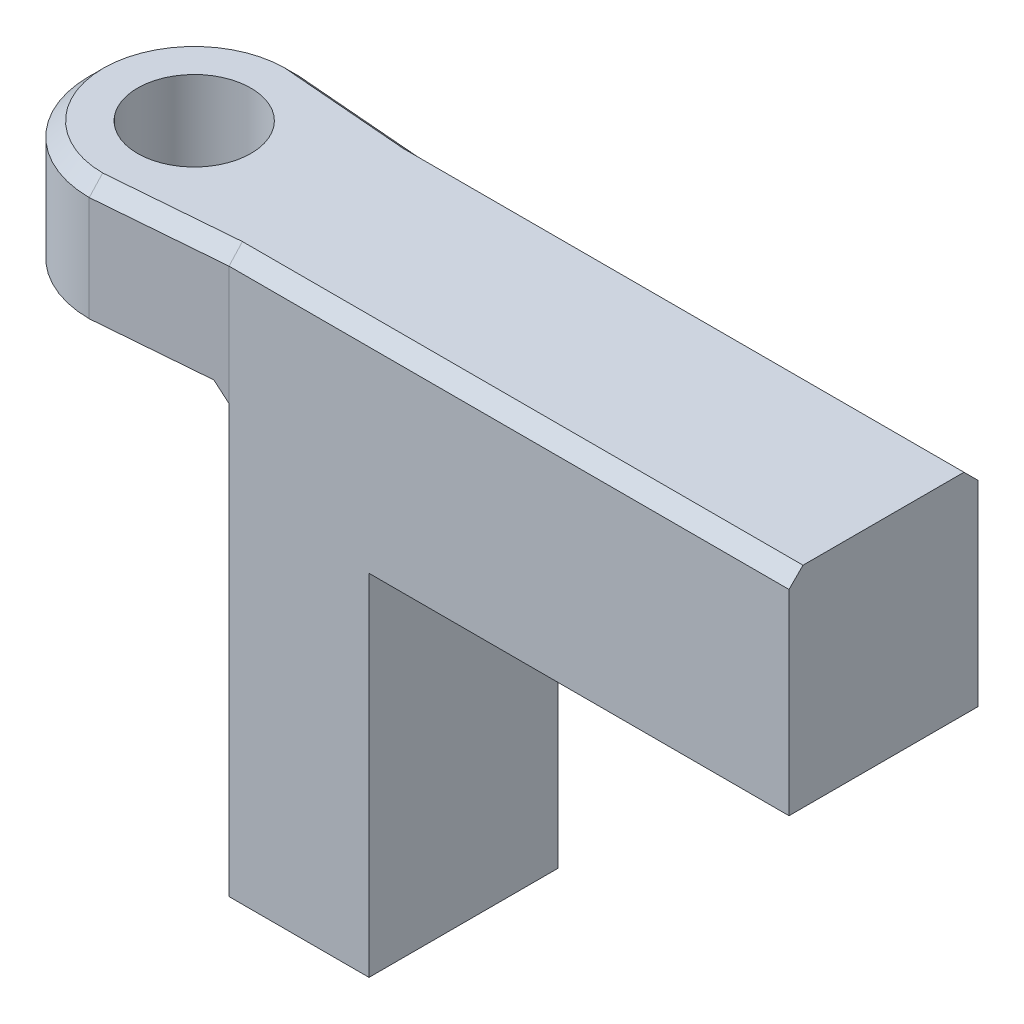
ISO-10303-21;
HEADER;
FILE_DESCRIPTION(('STEP AP214'),'2;1');
FILE_NAME('part.step','',(''),(''),'','','');
FILE_SCHEMA(('AUTOMOTIVE_DESIGN { 1 0 10303 214 1 1 1 1 }'));
ENDSEC;
DATA;
#1=APPLICATION_CONTEXT('core data for automotive mechanical design processes');
#2=APPLICATION_PROTOCOL_DEFINITION('international standard','automotive_design',2000,#1);
#3=PRODUCT_CONTEXT('',#1,'mechanical');
#4=PRODUCT('Part','Part','',(#3));
#5=PRODUCT_RELATED_PRODUCT_CATEGORY('part','',(#4));
#6=PRODUCT_DEFINITION_FORMATION('','',#4);
#7=PRODUCT_DEFINITION_CONTEXT('part definition',#1,'design');
#8=PRODUCT_DEFINITION('design','',#6,#7);
#9=PRODUCT_DEFINITION_SHAPE('','',#8);
#10=(LENGTH_UNIT() NAMED_UNIT(*) SI_UNIT(.MILLI.,.METRE.));
#11=(NAMED_UNIT(*) PLANE_ANGLE_UNIT() SI_UNIT($,.RADIAN.));
#12=(NAMED_UNIT(*) SI_UNIT($,.STERADIAN.) SOLID_ANGLE_UNIT());
#13=UNCERTAINTY_MEASURE_WITH_UNIT(LENGTH_MEASURE(1.E-05),#10,'distance_accuracy_value','');
#14=(GEOMETRIC_REPRESENTATION_CONTEXT(3) GLOBAL_UNCERTAINTY_ASSIGNED_CONTEXT((#13)) GLOBAL_UNIT_ASSIGNED_CONTEXT((#10,
#11,#12)) REPRESENTATION_CONTEXT('',''));
#15=CARTESIAN_POINT('',(0.,0.,0.));
#16=DIRECTION('',(0.,0.,1.));
#17=DIRECTION('',(1.,0.,0.));
#18=AXIS2_PLACEMENT_3D('',#15,#16,#17);
#19=CARTESIAN_POINT('',(38.4710133724813,-65.,0.));
#20=DIRECTION('',(-1.,0.,0.));
#21=DIRECTION('',(0.,0.,1.));
#22=AXIS2_PLACEMENT_3D('',#19,#20,#21);
#23=PLANE('',#22);
#24=DIRECTION('',(0.,0.,-1.));
#25=VECTOR('',#24,1.);
#26=CARTESIAN_POINT('',(38.4710133724813,-15.,13.5));
#27=LINE('',#26,#25);
#28=CARTESIAN_POINT('',(38.4710133724813,-15.,13.5));
#29=VERTEX_POINT('',#28);
#30=CARTESIAN_POINT('',(38.4710133724813,-15.,-13.5));
#31=VERTEX_POINT('',#30);
#32=EDGE_CURVE('E173',#29,#31,#27,.T.);
#33=ORIENTED_EDGE('',*,*,#32,.F.);
#34=DIRECTION('',(0.,1.,0.));
#35=VECTOR('',#34,1.);
#36=CARTESIAN_POINT('',(38.4710133724813,-65.,13.5));
#37=LINE('',#36,#35);
#38=CARTESIAN_POINT('',(38.4710133724813,-65.,13.5));
#39=VERTEX_POINT('',#38);
#40=EDGE_CURVE('E160',#39,#29,#37,.T.);
#41=ORIENTED_EDGE('',*,*,#40,.F.);
#42=DIRECTION('',(0.,0.,1.));
#43=VECTOR('',#42,1.);
#44=CARTESIAN_POINT('',(38.4710133724813,-65.,0.));
#45=LINE('',#44,#43);
#46=CARTESIAN_POINT('',(38.4710133724813,-65.,-13.5));
#47=VERTEX_POINT('',#46);
#48=EDGE_CURVE('E183',#47,#39,#45,.T.);
#49=ORIENTED_EDGE('',*,*,#48,.F.);
#50=DIRECTION('',(0.,1.,0.));
#51=VECTOR('',#50,1.);
#52=CARTESIAN_POINT('',(38.4710133724813,-65.,-13.5));
#53=LINE('',#52,#51);
#54=EDGE_CURVE('E186',#47,#31,#53,.T.);
#55=ORIENTED_EDGE('',*,*,#54,.T.);
#56=EDGE_LOOP('',(#33,#41,#49,#55));
#57=FACE_BOUND('',#56,.T.);
#58=ADVANCED_FACE('F45',(#57),#23,.F.);
#59=CARTESIAN_POINT('',(1.21014418007502,15.,14.9017262218641));
#60=DIRECTION('',(0.0809418631430002,0.,0.996718824338609));
#61=DIRECTION('',(0.99671882433861,0.,-0.0809418631430002));
#62=AXIS2_PLACEMENT_3D('',#59,#60,#61);
#63=PLANE('',#62);
#64=DIRECTION('',(0.,-1.,0.));
#65=VECTOR('',#64,1.);
#66=CARTESIAN_POINT('',(18.4710133724813,15.,13.5));
#67=LINE('',#66,#65);
#68=CARTESIAN_POINT('',(18.4710133724813,13.,13.5));
#69=VERTEX_POINT('',#68);
#70=CARTESIAN_POINT('',(18.4710133724813,-4.,13.5));
#71=VERTEX_POINT('',#70);
#72=EDGE_CURVE('E233',#69,#71,#67,.T.);
#73=ORIENTED_EDGE('',*,*,#72,.F.);
#74=DIRECTION('',(-0.99671882433861,0.,0.0809418631430002));
#75=VECTOR('',#74,1.);
#76=CARTESIAN_POINT('',(1.21014418007502,13.,14.9017262218641));
#77=LINE('',#76,#75);
#78=CARTESIAN_POINT('',(0.,13.,15.));
#79=VERTEX_POINT('',#78);
#80=EDGE_CURVE('E54',#69,#79,#77,.T.);
#81=ORIENTED_EDGE('',*,*,#80,.T.);
#82=DIRECTION('',(0.,-1.,0.));
#83=VECTOR('',#82,1.);
#84=CARTESIAN_POINT('',(0.,15.,15.));
#85=LINE('',#84,#83);
#86=CARTESIAN_POINT('',(0.,-2.,15.));
#87=VERTEX_POINT('',#86);
#88=EDGE_CURVE('E225',#79,#87,#85,.T.);
#89=ORIENTED_EDGE('',*,*,#88,.T.);
#90=DIRECTION('',(-0.99671882433861,0.,0.0809418631430002));
#91=VECTOR('',#90,1.);
#92=CARTESIAN_POINT('',(1.21014418007502,-2.,14.9017262218641));
#93=LINE('',#92,#91);
#94=CARTESIAN_POINT('',(16.4710133724813,-2.,13.6624166438247));
#95=VERTEX_POINT('',#94);
#96=EDGE_CURVE('E210',#95,#87,#93,.T.);
#97=ORIENTED_EDGE('',*,*,#96,.F.);
#98=DIRECTION('',(0.705943850922591,-0.705943850922582,-0.0573285154977738));
#99=VECTOR('',#98,1.);
#100=CARTESIAN_POINT('',(17.023941115335,-2.5529277428537,13.6175143096888));
#101=LINE('',#100,#99);
#102=EDGE_CURVE('E241',#95,#71,#101,.T.);
#103=ORIENTED_EDGE('',*,*,#102,.T.);
#104=EDGE_LOOP('',(#73,#81,#89,#97,#103));
#105=FACE_BOUND('',#104,.T.);
#106=ADVANCED_FACE('F301',(#105),#63,.T.);
#107=CARTESIAN_POINT('',(1.21014418007503,15.,-14.9017262218641));
#108=DIRECTION('',(0.0809418631430008,0.,-0.996718824338609));
#109=DIRECTION('',(-0.99671882433861,0.,-0.0809418631430008));
#110=AXIS2_PLACEMENT_3D('',#107,#108,#109);
#111=PLANE('',#110);
#112=DIRECTION('',(0.,-1.,0.));
#113=VECTOR('',#112,1.);
#114=CARTESIAN_POINT('',(0.,15.,-15.));
#115=LINE('',#114,#113);
#116=CARTESIAN_POINT('',(0.,13.,-15.));
#117=VERTEX_POINT('',#116);
#118=CARTESIAN_POINT('',(0.,-2.,-15.));
#119=VERTEX_POINT('',#118);
#120=EDGE_CURVE('E229',#117,#119,#115,.T.);
#121=ORIENTED_EDGE('',*,*,#120,.F.);
#122=DIRECTION('',(0.99671882433861,0.,0.0809418631430008));
#123=VECTOR('',#122,1.);
#124=CARTESIAN_POINT('',(1.21014418007503,13.,-14.9017262218641));
#125=LINE('',#124,#123);
#126=CARTESIAN_POINT('',(18.4710133724813,13.,-13.5));
#127=VERTEX_POINT('',#126);
#128=EDGE_CURVE('E263',#117,#127,#125,.T.);
#129=ORIENTED_EDGE('',*,*,#128,.T.);
#130=DIRECTION('',(0.,-1.,0.));
#131=VECTOR('',#130,1.);
#132=CARTESIAN_POINT('',(18.4710133724813,15.,-13.5));
#133=LINE('',#132,#131);
#134=CARTESIAN_POINT('',(18.4710133724813,-4.,-13.5));
#135=VERTEX_POINT('',#134);
#136=EDGE_CURVE('E231',#127,#135,#133,.T.);
#137=ORIENTED_EDGE('',*,*,#136,.T.);
#138=DIRECTION('',(-0.705943850922591,0.705943850922582,-0.0573285154977743));
#139=VECTOR('',#138,1.);
#140=CARTESIAN_POINT('',(17.023941115335,-2.5529277428537,-13.6175143096888));
#141=LINE('',#140,#139);
#142=CARTESIAN_POINT('',(16.4710133724813,-2.,-13.6624166438247));
#143=VERTEX_POINT('',#142);
#144=EDGE_CURVE('E244',#135,#143,#141,.T.);
#145=ORIENTED_EDGE('',*,*,#144,.T.);
#146=DIRECTION('',(0.99671882433861,0.,0.0809418631430008));
#147=VECTOR('',#146,1.);
#148=CARTESIAN_POINT('',(1.21014418007503,-2.,-14.9017262218641));
#149=LINE('',#148,#147);
#150=EDGE_CURVE('E213',#119,#143,#149,.T.);
#151=ORIENTED_EDGE('',*,*,#150,.F.);
#152=EDGE_LOOP('',(#121,#129,#137,#145,#151));
#153=FACE_BOUND('',#152,.T.);
#154=ADVANCED_FACE('F307',(#153),#111,.T.);
#155=CARTESIAN_POINT('',(0.,15.,0.));
#156=DIRECTION('',(0.,-1.,0.));
#157=DIRECTION('',(0.,0.,-1.));
#158=AXIS2_PLACEMENT_3D('',#155,#156,#157);
#159=CYLINDRICAL_SURFACE('',#158,8.1);
#160=CARTESIAN_POINT('',(0.,15.,0.));
#161=DIRECTION('',(0.,1.,0.));
#162=DIRECTION('',(0.,0.,1.));
#163=AXIS2_PLACEMENT_3D('',#160,#161,#162);
#164=CIRCLE('',#163,8.1);
#165=CARTESIAN_POINT('',(0.,15.,8.1));
#166=VERTEX_POINT('',#165);
#167=EDGE_CURVE('E222',#166,#166,#164,.T.);
#168=ORIENTED_EDGE('',*,*,#167,.T.);
#169=EDGE_LOOP('',(#168));
#170=FACE_BOUND('',#169,.T.);
#171=CARTESIAN_POINT('',(0.,0.,0.));
#172=DIRECTION('',(0.,1.,0.));
#173=DIRECTION('',(0.,0.,1.));
#174=AXIS2_PLACEMENT_3D('',#171,#172,#173);
#175=CIRCLE('',#174,8.1);
#176=CARTESIAN_POINT('',(0.,0.,8.1));
#177=VERTEX_POINT('',#176);
#178=EDGE_CURVE('E219',#177,#177,#175,.T.);
#179=ORIENTED_EDGE('',*,*,#178,.F.);
#180=EDGE_LOOP('',(#179));
#181=FACE_BOUND('',#180,.T.);
#182=ADVANCED_FACE('F358',(#170,#181),#159,.F.);
#183=CARTESIAN_POINT('',(0.,15.,0.));
#184=DIRECTION('',(0.,-1.,0.));
#185=DIRECTION('',(0.,0.,-1.));
#186=AXIS2_PLACEMENT_3D('',#183,#184,#185);
#187=CYLINDRICAL_SURFACE('',#186,15.);
#188=ORIENTED_EDGE('',*,*,#88,.F.);
#189=CARTESIAN_POINT('',(0.,13.,0.));
#190=DIRECTION('',(0.,1.,0.));
#191=DIRECTION('',(0.,0.,1.));
#192=AXIS2_PLACEMENT_3D('',#189,#190,#191);
#193=CIRCLE('',#192,15.);
#194=EDGE_CURVE('E11',#79,#117,#193,.F.);
#195=ORIENTED_EDGE('',*,*,#194,.T.);
#196=ORIENTED_EDGE('',*,*,#120,.T.);
#197=CARTESIAN_POINT('',(0.,-2.,0.));
#198=DIRECTION('',(0.,1.,0.));
#199=DIRECTION('',(0.,0.,1.));
#200=AXIS2_PLACEMENT_3D('',#197,#198,#199);
#201=CIRCLE('',#200,15.);
#202=EDGE_CURVE('E216',#119,#87,#201,.T.);
#203=ORIENTED_EDGE('',*,*,#202,.T.);
#204=EDGE_LOOP('',(#188,#195,#196,#203));
#205=FACE_BOUND('',#204,.T.);
#206=ADVANCED_FACE('F354',(#205),#187,.T.);
#207=CARTESIAN_POINT('',(0.,15.,0.));
#208=DIRECTION('',(0.,1.,0.));
#209=DIRECTION('',(0.,0.,1.));
#210=AXIS2_PLACEMENT_3D('',#207,#208,#209);
#211=PLANE('',#210);
#212=ORIENTED_EDGE('',*,*,#167,.F.);
#213=EDGE_LOOP('',(#212));
#214=FACE_BOUND('',#213,.T.);
#215=DIRECTION('',(0.99671882433861,0.,-0.0809418631430002));
#216=VECTOR('',#215,1.);
#217=CARTESIAN_POINT('',(1.04826045378902,15.,12.9082885731869));
#218=LINE('',#217,#216);
#219=CARTESIAN_POINT('',(-0.0781800510825452,15.,12.9997649163211));
#220=VERTEX_POINT('',#219);
#221=CARTESIAN_POINT('',(18.3899384988876,15.,11.5));
#222=VERTEX_POINT('',#221);
#223=EDGE_CURVE('E250',#220,#222,#218,.T.);
#224=ORIENTED_EDGE('',*,*,#223,.T.);
#225=DIRECTION('',(1.,0.,0.));
#226=VECTOR('',#225,1.);
#227=CARTESIAN_POINT('',(98.4710133724813,15.,11.5));
#228=LINE('',#227,#226);
#229=CARTESIAN_POINT('',(98.4710133724813,15.,11.5));
#230=VERTEX_POINT('',#229);
#231=EDGE_CURVE('E256',#222,#230,#228,.T.);
#232=ORIENTED_EDGE('',*,*,#231,.T.);
#233=DIRECTION('',(0.,0.,1.));
#234=VECTOR('',#233,1.);
#235=CARTESIAN_POINT('',(98.4710133724813,15.,13.5));
#236=LINE('',#235,#234);
#237=CARTESIAN_POINT('',(98.4710133724813,15.,-11.5));
#238=VERTEX_POINT('',#237);
#239=EDGE_CURVE('E152',#238,#230,#236,.T.);
#240=ORIENTED_EDGE('',*,*,#239,.F.);
#241=DIRECTION('',(-1.,0.,0.));
#242=VECTOR('',#241,1.);
#243=CARTESIAN_POINT('',(18.4710133724813,15.,-11.5));
#244=LINE('',#243,#242);
#245=CARTESIAN_POINT('',(18.3899384988873,15.,-11.5));
#246=VERTEX_POINT('',#245);
#247=EDGE_CURVE('E254',#238,#246,#244,.T.);
#248=ORIENTED_EDGE('',*,*,#247,.T.);
#249=DIRECTION('',(-0.99671882433861,0.,-0.0809418631430009));
#250=VECTOR('',#249,1.);
#251=CARTESIAN_POINT('',(1.04826045378902,15.,-12.9082885731869));
#252=LINE('',#251,#250);
#253=CARTESIAN_POINT('',(-0.0781800510825289,15.,-12.9997649163211));
#254=VERTEX_POINT('',#253);
#255=EDGE_CURVE('E252',#246,#254,#252,.T.);
#256=ORIENTED_EDGE('',*,*,#255,.T.);
#257=CARTESIAN_POINT('',(0.,15.,0.));
#258=DIRECTION('',(0.,1.,0.));
#259=DIRECTION('',(0.,0.,1.));
#260=AXIS2_PLACEMENT_3D('',#257,#258,#259);
#261=CIRCLE('',#260,13.);
#262=EDGE_CURVE('E248',#254,#220,#261,.T.);
#263=ORIENTED_EDGE('',*,*,#262,.T.);
#264=EDGE_LOOP('',(#224,#232,#240,#248,#256,#263));
#265=FACE_BOUND('',#264,.T.);
#266=ADVANCED_FACE('F350',(#214,#265),#211,.T.);
#267=CARTESIAN_POINT('',(0.,-2.,0.));
#268=DIRECTION('',(0.,1.,0.));
#269=DIRECTION('',(0.,0.,1.));
#270=AXIS2_PLACEMENT_3D('',#267,#268,#269);
#271=CYLINDRICAL_SURFACE('',#270,5.);
#272=CARTESIAN_POINT('',(0.,-2.,0.));
#273=DIRECTION('',(0.,1.,0.));
#274=DIRECTION('',(0.,0.,1.));
#275=AXIS2_PLACEMENT_3D('',#272,#273,#274);
#276=CIRCLE('',#275,5.);
#277=CARTESIAN_POINT('',(0.,-2.,5.));
#278=VERTEX_POINT('',#277);
#279=EDGE_CURVE('E207',#278,#278,#276,.T.);
#280=ORIENTED_EDGE('',*,*,#279,.F.);
#281=EDGE_LOOP('',(#280));
#282=FACE_BOUND('',#281,.T.);
#283=CARTESIAN_POINT('',(0.,0.,0.));
#284=DIRECTION('',(0.,1.,0.));
#285=DIRECTION('',(0.,0.,1.));
#286=AXIS2_PLACEMENT_3D('',#283,#284,#285);
#287=CIRCLE('',#286,5.);
#288=CARTESIAN_POINT('',(0.,0.,5.));
#289=VERTEX_POINT('',#288);
#290=EDGE_CURVE('E204',#289,#289,#287,.T.);
#291=ORIENTED_EDGE('',*,*,#290,.T.);
#292=EDGE_LOOP('',(#291));
#293=FACE_BOUND('',#292,.T.);
#294=ADVANCED_FACE('F343',(#282,#293),#271,.F.);
#295=CARTESIAN_POINT('',(0.,-2.,0.));
#296=DIRECTION('',(0.,1.,0.));
#297=DIRECTION('',(0.,0.,1.));
#298=AXIS2_PLACEMENT_3D('',#295,#296,#297);
#299=PLANE('',#298);
#300=CARTESIAN_POINT('',(0.,-2.,10.));
#301=DIRECTION('',(0.,-1.,0.));
#302=DIRECTION('',(0.,0.,-1.));
#303=AXIS2_PLACEMENT_3D('',#300,#301,#302);
#304=CIRCLE('',#303,1.5);
#305=CARTESIAN_POINT('',(0.,-2.,8.5));
#306=VERTEX_POINT('',#305);
#307=EDGE_CURVE('E188',#306,#306,#304,.T.);
#308=ORIENTED_EDGE('',*,*,#307,.F.);
#309=EDGE_LOOP('',(#308));
#310=FACE_BOUND('',#309,.T.);
#311=CARTESIAN_POINT('',(0.,-2.,-10.));
#312=DIRECTION('',(0.,-1.,0.));
#313=DIRECTION('',(0.,0.,-1.));
#314=AXIS2_PLACEMENT_3D('',#311,#312,#313);
#315=CIRCLE('',#314,1.5);
#316=CARTESIAN_POINT('',(0.,-2.,-11.5));
#317=VERTEX_POINT('',#316);
#318=EDGE_CURVE('E198',#317,#317,#315,.T.);
#319=ORIENTED_EDGE('',*,*,#318,.F.);
#320=EDGE_LOOP('',(#319));
#321=FACE_BOUND('',#320,.T.);
#322=ORIENTED_EDGE('',*,*,#279,.T.);
#323=EDGE_LOOP('',(#322));
#324=FACE_BOUND('',#323,.T.);
#325=ORIENTED_EDGE('',*,*,#150,.T.);
#326=DIRECTION('',(0.,0.,1.));
#327=VECTOR('',#326,1.);
#328=CARTESIAN_POINT('',(16.4710133724813,-2.,0.));
#329=LINE('',#328,#327);
#330=EDGE_CURVE('E235',#143,#95,#329,.T.);
#331=ORIENTED_EDGE('',*,*,#330,.T.);
#332=ORIENTED_EDGE('',*,*,#96,.T.);
#333=ORIENTED_EDGE('',*,*,#202,.F.);
#334=EDGE_LOOP('',(#325,#331,#332,#333));
#335=FACE_BOUND('',#334,.T.);
#336=ADVANCED_FACE('F340',(#310,#321,#324,#335),#299,.F.);
#337=CARTESIAN_POINT('',(0.,0.,0.));
#338=DIRECTION('',(0.,1.,0.));
#339=DIRECTION('',(0.,0.,1.));
#340=AXIS2_PLACEMENT_3D('',#337,#338,#339);
#341=PLANE('',#340);
#342=ORIENTED_EDGE('',*,*,#178,.T.);
#343=EDGE_LOOP('',(#342));
#344=FACE_BOUND('',#343,.T.);
#345=ORIENTED_EDGE('',*,*,#290,.F.);
#346=EDGE_LOOP('',(#345));
#347=FACE_BOUND('',#346,.T.);
#348=ADVANCED_FACE('F338',(#344,#347),#341,.T.);
#349=CARTESIAN_POINT('',(0.,8.,-10.));
#350=DIRECTION('',(0.,-1.,0.));
#351=DIRECTION('',(0.,0.,-1.));
#352=AXIS2_PLACEMENT_3D('',#349,#350,#351);
#353=CYLINDRICAL_SURFACE('',#352,1.5);
#354=CARTESIAN_POINT('',(0.,8.,-10.));
#355=DIRECTION('',(0.,-1.,0.));
#356=DIRECTION('',(0.,0.,-1.));
#357=AXIS2_PLACEMENT_3D('',#354,#355,#356);
#358=CIRCLE('',#357,1.5);
#359=CARTESIAN_POINT('',(0.,8.,-11.5));
#360=VERTEX_POINT('',#359);
#361=EDGE_CURVE('E201',#360,#360,#358,.T.);
#362=ORIENTED_EDGE('',*,*,#361,.F.);
#363=EDGE_LOOP('',(#362));
#364=FACE_BOUND('',#363,.T.);
#365=ORIENTED_EDGE('',*,*,#318,.T.);
#366=EDGE_LOOP('',(#365));
#367=FACE_BOUND('',#366,.T.);
#368=ADVANCED_FACE('F334',(#364,#367),#353,.F.);
#369=CARTESIAN_POINT('',(0.,8.,-10.));
#370=DIRECTION('',(0.,-1.,0.));
#371=DIRECTION('',(0.,0.,-1.));
#372=AXIS2_PLACEMENT_3D('',#369,#370,#371);
#373=PLANE('',#372);
#374=ORIENTED_EDGE('',*,*,#361,.T.);
#375=EDGE_LOOP('',(#374));
#376=FACE_BOUND('',#375,.T.);
#377=ADVANCED_FACE('F330',(#376),#373,.T.);
#378=CARTESIAN_POINT('',(0.,8.,10.));
#379=DIRECTION('',(0.,-1.,0.));
#380=DIRECTION('',(0.,0.,-1.));
#381=AXIS2_PLACEMENT_3D('',#378,#379,#380);
#382=CYLINDRICAL_SURFACE('',#381,1.5);
#383=CARTESIAN_POINT('',(0.,8.,10.));
#384=DIRECTION('',(0.,-1.,0.));
#385=DIRECTION('',(0.,0.,-1.));
#386=AXIS2_PLACEMENT_3D('',#383,#384,#385);
#387=CIRCLE('',#386,1.5);
#388=CARTESIAN_POINT('',(0.,8.,8.5));
#389=VERTEX_POINT('',#388);
#390=EDGE_CURVE('E195',#389,#389,#387,.T.);
#391=ORIENTED_EDGE('',*,*,#390,.F.);
#392=EDGE_LOOP('',(#391));
#393=FACE_BOUND('',#392,.T.);
#394=ORIENTED_EDGE('',*,*,#307,.T.);
#395=EDGE_LOOP('',(#394));
#396=FACE_BOUND('',#395,.T.);
#397=ADVANCED_FACE('F326',(#393,#396),#382,.F.);
#398=CARTESIAN_POINT('',(0.,8.,10.));
#399=DIRECTION('',(0.,-1.,0.));
#400=DIRECTION('',(0.,0.,-1.));
#401=AXIS2_PLACEMENT_3D('',#398,#399,#400);
#402=PLANE('',#401);
#403=ORIENTED_EDGE('',*,*,#390,.T.);
#404=EDGE_LOOP('',(#403));
#405=FACE_BOUND('',#404,.T.);
#406=ADVANCED_FACE('F319',(#405),#402,.T.);
#407=CARTESIAN_POINT('',(18.4710133724813,-65.,0.));
#408=DIRECTION('',(-1.,0.,0.));
#409=DIRECTION('',(0.,0.,1.));
#410=AXIS2_PLACEMENT_3D('',#407,#408,#409);
#411=PLANE('',#410);
#412=DIRECTION('',(0.,1.,0.));
#413=VECTOR('',#412,1.);
#414=CARTESIAN_POINT('',(18.4710133724813,-65.,13.5));
#415=LINE('',#414,#413);
#416=CARTESIAN_POINT('',(18.4710133724813,-65.,13.5));
#417=VERTEX_POINT('',#416);
#418=EDGE_CURVE('E190',#417,#71,#415,.T.);
#419=ORIENTED_EDGE('',*,*,#418,.T.);
#420=DIRECTION('',(0.,0.,-1.));
#421=VECTOR('',#420,1.);
#422=CARTESIAN_POINT('',(18.4710133724813,-4.,0.));
#423=LINE('',#422,#421);
#424=EDGE_CURVE('E238',#71,#135,#423,.T.);
#425=ORIENTED_EDGE('',*,*,#424,.T.);
#426=DIRECTION('',(0.,1.,0.));
#427=VECTOR('',#426,1.);
#428=CARTESIAN_POINT('',(18.4710133724813,-65.,-13.5));
#429=LINE('',#428,#427);
#430=CARTESIAN_POINT('',(18.4710133724813,-65.,-13.5));
#431=VERTEX_POINT('',#430);
#432=EDGE_CURVE('E185',#431,#135,#429,.T.);
#433=ORIENTED_EDGE('',*,*,#432,.F.);
#434=DIRECTION('',(0.,0.,1.));
#435=VECTOR('',#434,1.);
#436=CARTESIAN_POINT('',(18.4710133724813,-65.,0.));
#437=LINE('',#436,#435);
#438=EDGE_CURVE('E178',#431,#417,#437,.T.);
#439=ORIENTED_EDGE('',*,*,#438,.T.);
#440=EDGE_LOOP('',(#419,#425,#433,#439));
#441=FACE_BOUND('',#440,.T.);
#442=ADVANCED_FACE('F316',(#441),#411,.T.);
#443=CARTESIAN_POINT('',(0.,-65.,-13.5));
#444=DIRECTION('',(0.,0.,1.));
#445=DIRECTION('',(1.,0.,0.));
#446=AXIS2_PLACEMENT_3D('',#443,#444,#445);
#447=PLANE('',#446);
#448=ORIENTED_EDGE('',*,*,#136,.F.);
#449=DIRECTION('',(1.,0.,0.));
#450=VECTOR('',#449,1.);
#451=CARTESIAN_POINT('',(98.4710133724813,13.,-13.5));
#452=LINE('',#451,#450);
#453=CARTESIAN_POINT('',(98.4710133724813,13.,-13.5));
#454=VERTEX_POINT('',#453);
#455=EDGE_CURVE('E261',#127,#454,#452,.T.);
#456=ORIENTED_EDGE('',*,*,#455,.T.);
#457=DIRECTION('',(0.,1.,0.));
#458=VECTOR('',#457,1.);
#459=CARTESIAN_POINT('',(98.4710133724813,-15.,-13.5));
#460=LINE('',#459,#458);
#461=CARTESIAN_POINT('',(98.4710133724813,-15.,-13.5));
#462=VERTEX_POINT('',#461);
#463=EDGE_CURVE('E174',#462,#454,#460,.T.);
#464=ORIENTED_EDGE('',*,*,#463,.F.);
#465=DIRECTION('',(-1.,0.,0.));
#466=VECTOR('',#465,1.);
#467=CARTESIAN_POINT('',(98.4710133724813,-15.,-13.5));
#468=LINE('',#467,#466);
#469=EDGE_CURVE('E164',#462,#31,#468,.T.);
#470=ORIENTED_EDGE('',*,*,#469,.T.);
#471=ORIENTED_EDGE('',*,*,#54,.F.);
#472=DIRECTION('',(1.,0.,0.));
#473=VECTOR('',#472,1.);
#474=CARTESIAN_POINT('',(0.,-65.,-13.5));
#475=LINE('',#474,#473);
#476=EDGE_CURVE('E163',#431,#47,#475,.T.);
#477=ORIENTED_EDGE('',*,*,#476,.F.);
#478=ORIENTED_EDGE('',*,*,#432,.T.);
#479=EDGE_LOOP('',(#448,#456,#464,#470,#471,#477,#478));
#480=FACE_BOUND('',#479,.T.);
#481=ADVANCED_FACE('F315',(#480),#447,.F.);
#482=CARTESIAN_POINT('',(0.,-65.,13.5));
#483=DIRECTION('',(0.,0.,-1.));
#484=DIRECTION('',(-1.,0.,0.));
#485=AXIS2_PLACEMENT_3D('',#482,#483,#484);
#486=PLANE('',#485);
#487=DIRECTION('',(0.,-1.,0.));
#488=VECTOR('',#487,1.);
#489=CARTESIAN_POINT('',(98.4710133724813,-15.,13.5));
#490=LINE('',#489,#488);
#491=CARTESIAN_POINT('',(98.4710133724813,13.,13.5));
#492=VERTEX_POINT('',#491);
#493=CARTESIAN_POINT('',(98.4710133724813,-15.,13.5));
#494=VERTEX_POINT('',#493);
#495=EDGE_CURVE('E139',#492,#494,#490,.T.);
#496=ORIENTED_EDGE('',*,*,#495,.F.);
#497=DIRECTION('',(-1.,0.,0.));
#498=VECTOR('',#497,1.);
#499=CARTESIAN_POINT('',(18.4710133724813,13.,13.5));
#500=LINE('',#499,#498);
#501=EDGE_CURVE('E246',#492,#69,#500,.T.);
#502=ORIENTED_EDGE('',*,*,#501,.T.);
#503=ORIENTED_EDGE('',*,*,#72,.T.);
#504=ORIENTED_EDGE('',*,*,#418,.F.);
#505=DIRECTION('',(-1.,0.,0.));
#506=VECTOR('',#505,1.);
#507=CARTESIAN_POINT('',(0.,-65.,13.5));
#508=LINE('',#507,#506);
#509=EDGE_CURVE('E181',#39,#417,#508,.T.);
#510=ORIENTED_EDGE('',*,*,#509,.F.);
#511=ORIENTED_EDGE('',*,*,#40,.T.);
#512=DIRECTION('',(-1.,0.,0.));
#513=VECTOR('',#512,1.);
#514=CARTESIAN_POINT('',(98.4710133724813,-15.,13.5));
#515=LINE('',#514,#513);
#516=EDGE_CURVE('E156',#494,#29,#515,.T.);
#517=ORIENTED_EDGE('',*,*,#516,.F.);
#518=EDGE_LOOP('',(#496,#502,#503,#504,#510,#511,#517));
#519=FACE_BOUND('',#518,.T.);
#520=ADVANCED_FACE('F157',(#519),#486,.F.);
#521=CARTESIAN_POINT('',(0.,-65.,0.));
#522=DIRECTION('',(0.,1.,0.));
#523=DIRECTION('',(0.,0.,1.));
#524=AXIS2_PLACEMENT_3D('',#521,#522,#523);
#525=PLANE('',#524);
#526=ORIENTED_EDGE('',*,*,#476,.T.);
#527=ORIENTED_EDGE('',*,*,#48,.T.);
#528=ORIENTED_EDGE('',*,*,#509,.T.);
#529=ORIENTED_EDGE('',*,*,#438,.F.);
#530=EDGE_LOOP('',(#526,#527,#528,#529));
#531=FACE_BOUND('',#530,.T.);
#532=ADVANCED_FACE('F311',(#531),#525,.F.);
#533=CARTESIAN_POINT('',(16.4710133724813,-2.,0.));
#534=DIRECTION('',(0.707106781186543,0.707106781186552,0.));
#535=DIRECTION('',(0.,0.,1.));
#536=AXIS2_PLACEMENT_3D('',#533,#534,#535);
#537=PLANE('',#536);
#538=ORIENTED_EDGE('',*,*,#144,.F.);
#539=ORIENTED_EDGE('',*,*,#424,.F.);
#540=ORIENTED_EDGE('',*,*,#102,.F.);
#541=ORIENTED_EDGE('',*,*,#330,.F.);
#542=EDGE_LOOP('',(#538,#539,#540,#541));
#543=FACE_BOUND('',#542,.T.);
#544=ADVANCED_FACE('F365',(#543),#537,.F.);
#545=CARTESIAN_POINT('',(98.4710133724813,-15.,13.5));
#546=DIRECTION('',(0.,1.,0.));
#547=DIRECTION('',(0.,0.,1.));
#548=AXIS2_PLACEMENT_3D('',#545,#546,#547);
#549=PLANE('',#548);
#550=ORIENTED_EDGE('',*,*,#32,.T.);
#551=ORIENTED_EDGE('',*,*,#469,.F.);
#552=DIRECTION('',(0.,0.,-1.));
#553=VECTOR('',#552,1.);
#554=CARTESIAN_POINT('',(98.4710133724813,-15.,13.5));
#555=LINE('',#554,#553);
#556=EDGE_CURVE('E145',#494,#462,#555,.T.);
#557=ORIENTED_EDGE('',*,*,#556,.F.);
#558=ORIENTED_EDGE('',*,*,#516,.T.);
#559=EDGE_LOOP('',(#550,#551,#557,#558));
#560=FACE_BOUND('',#559,.T.);
#561=ADVANCED_FACE('F166',(#560),#549,.F.);
#562=CARTESIAN_POINT('',(98.4710133724813,0.,0.));
#563=DIRECTION('',(-1.,0.,0.));
#564=DIRECTION('',(0.,0.,1.));
#565=AXIS2_PLACEMENT_3D('',#562,#563,#564);
#566=PLANE('',#565);
#567=ORIENTED_EDGE('',*,*,#239,.T.);
#568=DIRECTION('',(0.,-0.707106781186548,0.707106781186547));
#569=VECTOR('',#568,1.);
#570=CARTESIAN_POINT('',(98.4710133724813,12.9999999999999,13.5));
#571=LINE('',#570,#569);
#572=EDGE_CURVE('E148',#230,#492,#571,.T.);
#573=ORIENTED_EDGE('',*,*,#572,.T.);
#574=ORIENTED_EDGE('',*,*,#495,.T.);
#575=ORIENTED_EDGE('',*,*,#556,.T.);
#576=ORIENTED_EDGE('',*,*,#463,.T.);
#577=DIRECTION('',(0.,0.707106781186547,0.707106781186548));
#578=VECTOR('',#577,1.);
#579=CARTESIAN_POINT('',(98.4710133724813,13.,-13.5));
#580=LINE('',#579,#578);
#581=EDGE_CURVE('E258',#454,#238,#580,.T.);
#582=ORIENTED_EDGE('',*,*,#581,.T.);
#583=EDGE_LOOP('',(#567,#573,#574,#575,#576,#582));
#584=FACE_BOUND('',#583,.T.);
#585=ADVANCED_FACE('F142',(#584),#566,.F.);
#586=CARTESIAN_POINT('',(0.,13.,-13.5));
#587=DIRECTION('',(0.,0.707106781186548,-0.707106781186547));
#588=DIRECTION('',(-1.,0.,0.));
#589=AXIS2_PLACEMENT_3D('',#586,#587,#588);
#590=PLANE('',#589);
#591=ORIENTED_EDGE('',*,*,#581,.F.);
#592=ORIENTED_EDGE('',*,*,#455,.F.);
#593=DIRECTION('',(-0.0286525278093092,0.706816465799339,0.70681646579934));
#594=VECTOR('',#593,1.);
#595=CARTESIAN_POINT('',(18.4558492735833,13.37407641173,-13.12592358827));
#596=LINE('',#595,#594);
#597=EDGE_CURVE('E49',#246,#127,#596,.F.);
#598=ORIENTED_EDGE('',*,*,#597,.F.);
#599=ORIENTED_EDGE('',*,*,#247,.F.);
#600=EDGE_LOOP('',(#591,#592,#598,#599));
#601=FACE_BOUND('',#600,.T.);
#602=ADVANCED_FACE('F47',(#601),#590,.T.);
#603=CARTESIAN_POINT('',(1.21014418007503,13.,-14.9017262218641));
#604=DIRECTION('',(-0.0572345403102897,-0.707106781186543,0.704786639626118));
#605=DIRECTION('',(0.99671882433861,0.,0.0809418631430008));
#606=AXIS2_PLACEMENT_3D('',#603,#604,#605);
#607=PLANE('',#606);
#608=ORIENTED_EDGE('',*,*,#597,.T.);
#609=ORIENTED_EDGE('',*,*,#128,.F.);
#610=CARTESIAN_POINT('',(-0.0781800510824869,15.,-12.9997649163216));
#611=CARTESIAN_POINT('',(-0.0656500473618207,14.6666771740864,-13.3331674928082));
#612=CARTESIAN_POINT('',(-0.0528700411087491,14.3333490911024,-13.6665550413854));
#613=CARTESIAN_POINT('',(-0.0268100240632467,13.6666824244353,-14.3333000692771));
#614=CARTESIAN_POINT('',(-0.0135300132909792,13.3333438407528,-14.6666575485929));
#615=CARTESIAN_POINT('',(-6.46964374744946E-12,13.0000000000001,-15.0000000000004));
#616=B_SPLINE_CURVE_WITH_KNOTS('',3,(#610,#611,#612,#613,#614,#615),.UNSPECIFIED.,.F.,.F.,(4,2,
4),(0.,1.41483701291264,2.82967396877021),.UNSPECIFIED.);
#617=EDGE_CURVE('E276',#254,#117,#616,.T.);
#618=ORIENTED_EDGE('',*,*,#617,.F.);
#619=ORIENTED_EDGE('',*,*,#255,.F.);
#620=EDGE_LOOP('',(#608,#609,#618,#619));
#621=FACE_BOUND('',#620,.T.);
#622=ADVANCED_FACE('F289',(#621),#607,.F.);
#623=CARTESIAN_POINT('',(0.,15.,0.));
#624=DIRECTION('',(0.,-1.,0.));
#625=DIRECTION('',(0.,0.,-1.));
#626=AXIS2_PLACEMENT_3D('',#623,#624,#625);
#627=CONICAL_SURFACE('',#626,13.,0.785398163397443);
#628=ORIENTED_EDGE('',*,*,#617,.T.);
#629=ORIENTED_EDGE('',*,*,#194,.F.);
#630=CARTESIAN_POINT('',(0.,13.,15.));
#631=CARTESIAN_POINT('',(-0.0135300132877406,13.3333438407527,14.6666575485927));
#632=CARTESIAN_POINT('',(-0.0268100240621725,13.6666824244353,14.3333000692771));
#633=CARTESIAN_POINT('',(-0.0528700411098696,14.3333490911024,13.6665550413855));
#634=CARTESIAN_POINT('',(-0.0656500473629715,14.6666771740865,13.3331674928083));
#635=CARTESIAN_POINT('',(-0.0781800510826011,15.,12.9997649163216));
#636=B_SPLINE_CURVE_WITH_KNOTS('',3,(#630,#631,#632,#633,#634,#635),.UNSPECIFIED.,.F.,.F.,(4,2,
4),(0.,1.41483695585757,2.82967396877022),.UNSPECIFIED.);
#637=EDGE_CURVE('E268',#220,#79,#636,.F.);
#638=ORIENTED_EDGE('',*,*,#637,.F.);
#639=ORIENTED_EDGE('',*,*,#262,.F.);
#640=EDGE_LOOP('',(#628,#629,#638,#639));
#641=FACE_BOUND('',#640,.T.);
#642=ADVANCED_FACE('F281',(#641),#627,.T.);
#643=CARTESIAN_POINT('',(1.21014418007502,13.,14.9017262218641));
#644=DIRECTION('',(-0.0572345403102892,-0.707106781186543,-0.704786639626118));
#645=DIRECTION('',(-0.99671882433861,0.,0.0809418631430002));
#646=AXIS2_PLACEMENT_3D('',#643,#644,#645);
#647=PLANE('',#646);
#648=ORIENTED_EDGE('',*,*,#637,.T.);
#649=ORIENTED_EDGE('',*,*,#80,.F.);
#650=DIRECTION('',(0.0286525278093327,-0.706816465799339,0.706816465799338));
#651=VECTOR('',#650,1.);
#652=CARTESIAN_POINT('',(18.4558492735836,13.3740764117303,13.1259235882697));
#653=LINE('',#652,#651);
#654=EDGE_CURVE('E266',#222,#69,#653,.T.);
#655=ORIENTED_EDGE('',*,*,#654,.F.);
#656=ORIENTED_EDGE('',*,*,#223,.F.);
#657=EDGE_LOOP('',(#648,#649,#655,#656));
#658=FACE_BOUND('',#657,.T.);
#659=ADVANCED_FACE('F284',(#658),#647,.F.);
#660=CARTESIAN_POINT('',(0.,13.,13.5));
#661=DIRECTION('',(0.,0.707106781186547,0.707106781186548));
#662=DIRECTION('',(1.,0.,0.));
#663=AXIS2_PLACEMENT_3D('',#660,#661,#662);
#664=PLANE('',#663);
#665=ORIENTED_EDGE('',*,*,#572,.F.);
#666=ORIENTED_EDGE('',*,*,#231,.F.);
#667=ORIENTED_EDGE('',*,*,#654,.T.);
#668=ORIENTED_EDGE('',*,*,#501,.F.);
#669=EDGE_LOOP('',(#665,#666,#667,#668));
#670=FACE_BOUND('',#669,.T.);
#671=ADVANCED_FACE('F287',(#670),#664,.T.);
#672=CLOSED_SHELL('',(#58,#106,#154,#182,#206,#266,#294,#336,#348,#368,#377,#397,#406,#442,#481,
#520,#532,#544,#561,#585,#602,#622,#642,#659,#671));
#673=MANIFOLD_SOLID_BREP('B2',#672);
#674=ADVANCED_BREP_SHAPE_REPRESENTATION('',(#18,#673),#14);
#675=SHAPE_DEFINITION_REPRESENTATION(#9,#674);
ENDSEC;
END-ISO-10303-21;
